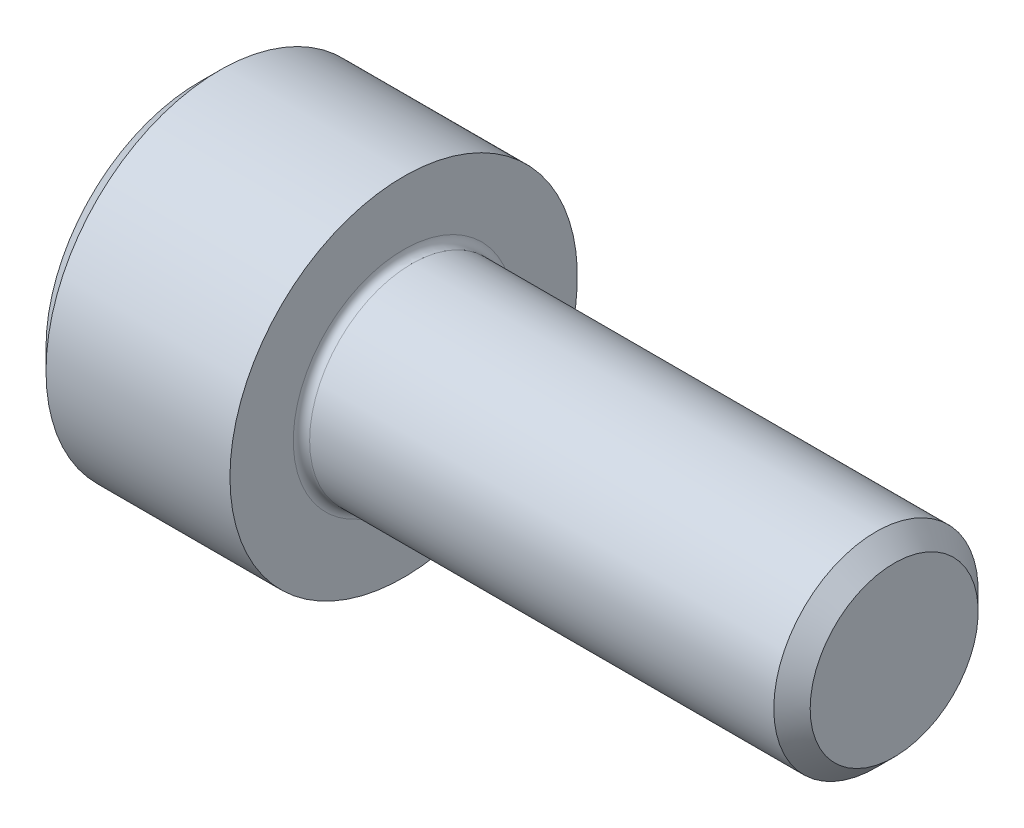
ISO-10303-21;
HEADER;
FILE_DESCRIPTION(('STEP AP214'),'2;1');
FILE_NAME('part.step','',(''),(''),'','','');
FILE_SCHEMA(('AUTOMOTIVE_DESIGN { 1 0 10303 214 1 1 1 1 }'));
ENDSEC;
DATA;
#1=APPLICATION_CONTEXT('core data for automotive mechanical design processes');
#2=APPLICATION_PROTOCOL_DEFINITION('international standard','automotive_design',2000,#1);
#3=PRODUCT_CONTEXT('',#1,'mechanical');
#4=PRODUCT('Part','Part','',(#3));
#5=PRODUCT_RELATED_PRODUCT_CATEGORY('part','',(#4));
#6=PRODUCT_DEFINITION_FORMATION('','',#4);
#7=PRODUCT_DEFINITION_CONTEXT('part definition',#1,'design');
#8=PRODUCT_DEFINITION('design','',#6,#7);
#9=PRODUCT_DEFINITION_SHAPE('','',#8);
#10=(LENGTH_UNIT() NAMED_UNIT(*) SI_UNIT(.MILLI.,.METRE.));
#11=(NAMED_UNIT(*) PLANE_ANGLE_UNIT() SI_UNIT($,.RADIAN.));
#12=(NAMED_UNIT(*) SI_UNIT($,.STERADIAN.) SOLID_ANGLE_UNIT());
#13=UNCERTAINTY_MEASURE_WITH_UNIT(LENGTH_MEASURE(1.E-05),#10,'distance_accuracy_value','');
#14=(GEOMETRIC_REPRESENTATION_CONTEXT(3) GLOBAL_UNCERTAINTY_ASSIGNED_CONTEXT((#13)) GLOBAL_UNIT_ASSIGNED_CONTEXT((#10,
#11,#12)) REPRESENTATION_CONTEXT('',''));
#15=CARTESIAN_POINT('',(0.,0.,0.));
#16=DIRECTION('',(0.,0.,1.));
#17=DIRECTION('',(1.,0.,0.));
#18=AXIS2_PLACEMENT_3D('',#15,#16,#17);
#19=CARTESIAN_POINT('',(0.,0.,0.));
#20=DIRECTION('',(-1.,0.,0.));
#21=DIRECTION('',(0.,0.,1.));
#22=AXIS2_PLACEMENT_3D('',#19,#20,#21);
#23=PLANE('',#22);
#24=DIRECTION('',(0.,-0.499999999999999,0.866025403784439));
#25=VECTOR('',#24,1.);
#26=CARTESIAN_POINT('',(0.,2.35789849937043,0.));
#27=LINE('',#26,#25);
#28=CARTESIAN_POINT('',(0.,2.35789849937043,0.));
#29=VERTEX_POINT('',#28);
#30=CARTESIAN_POINT('',(0.,1.17894924968522,2.042));
#31=VERTEX_POINT('',#30);
#32=EDGE_CURVE('E262',#29,#31,#27,.T.);
#33=ORIENTED_EDGE('',*,*,#32,.T.);
#34=DIRECTION('',(0.,1.,0.));
#35=VECTOR('',#34,1.);
#36=CARTESIAN_POINT('',(0.,-1.17894924968522,2.042));
#37=LINE('',#36,#35);
#38=CARTESIAN_POINT('',(0.,-1.17894924968522,2.042));
#39=VERTEX_POINT('',#38);
#40=EDGE_CURVE('E133',#39,#31,#37,.T.);
#41=ORIENTED_EDGE('',*,*,#40,.F.);
#42=DIRECTION('',(0.,-0.500000000000001,-0.866025403784438));
#43=VECTOR('',#42,1.);
#44=CARTESIAN_POINT('',(0.,-1.17894924968522,2.042));
#45=LINE('',#44,#43);
#46=CARTESIAN_POINT('',(0.,-2.35789849937043,0.));
#47=VERTEX_POINT('',#46);
#48=EDGE_CURVE('E265',#39,#47,#45,.T.);
#49=ORIENTED_EDGE('',*,*,#48,.T.);
#50=DIRECTION('',(0.,0.499999999999998,-0.86602540378444));
#51=VECTOR('',#50,1.);
#52=CARTESIAN_POINT('',(0.,-2.35789849937043,0.));
#53=LINE('',#52,#51);
#54=CARTESIAN_POINT('',(0.,-1.17894924968522,-2.042));
#55=VERTEX_POINT('',#54);
#56=EDGE_CURVE('E268',#47,#55,#53,.T.);
#57=ORIENTED_EDGE('',*,*,#56,.T.);
#58=DIRECTION('',(0.,-1.,0.));
#59=VECTOR('',#58,1.);
#60=CARTESIAN_POINT('',(0.,1.17894924968521,-2.042));
#61=LINE('',#60,#59);
#62=CARTESIAN_POINT('',(0.,1.17894924968521,-2.042));
#63=VERTEX_POINT('',#62);
#64=EDGE_CURVE('E271',#63,#55,#61,.T.);
#65=ORIENTED_EDGE('',*,*,#64,.F.);
#66=DIRECTION('',(0.,-0.500000000000001,-0.866025403784438));
#67=VECTOR('',#66,1.);
#68=CARTESIAN_POINT('',(0.,2.35789849937043,0.));
#69=LINE('',#68,#67);
#70=EDGE_CURVE('E128',#29,#63,#69,.T.);
#71=ORIENTED_EDGE('',*,*,#70,.F.);
#72=EDGE_LOOP('',(#33,#41,#49,#57,#65,#71));
#73=FACE_BOUND('',#72,.T.);
#74=CARTESIAN_POINT('',(0.,0.,0.));
#75=DIRECTION('',(-1.,0.,0.));
#76=DIRECTION('',(0.,0.,1.));
#77=AXIS2_PLACEMENT_3D('',#74,#75,#76);
#78=CIRCLE('',#77,3.75);
#79=CARTESIAN_POINT('',(0.,0.,3.75));
#80=VERTEX_POINT('',#79);
#81=EDGE_CURVE('E157',#80,#80,#78,.T.);
#82=ORIENTED_EDGE('',*,*,#81,.T.);
#83=EDGE_LOOP('',(#82));
#84=FACE_BOUND('',#83,.T.);
#85=ADVANCED_FACE('F37',(#73,#84),#23,.T.);
#86=CARTESIAN_POINT('',(0.,0.,0.));
#87=DIRECTION('',(1.,0.,0.));
#88=DIRECTION('',(0.,0.,-1.));
#89=AXIS2_PLACEMENT_3D('',#86,#87,#88);
#90=CONICAL_SURFACE('',#89,3.75,0.785398163397443);
#91=CARTESIAN_POINT('',(0.5,0.,0.));
#92=DIRECTION('',(-1.,0.,0.));
#93=DIRECTION('',(0.,0.,1.));
#94=AXIS2_PLACEMENT_3D('',#91,#92,#93);
#95=CIRCLE('',#94,4.25);
#96=CARTESIAN_POINT('',(0.5,0.,4.25));
#97=VERTEX_POINT('',#96);
#98=EDGE_CURVE('E154',#97,#97,#95,.T.);
#99=ORIENTED_EDGE('',*,*,#98,.T.);
#100=EDGE_LOOP('',(#99));
#101=FACE_BOUND('',#100,.T.);
#102=ORIENTED_EDGE('',*,*,#81,.F.);
#103=EDGE_LOOP('',(#102));
#104=FACE_BOUND('',#103,.T.);
#105=ADVANCED_FACE('F178',(#101,#104),#90,.T.);
#106=CARTESIAN_POINT('',(-31.75,0.,0.));
#107=DIRECTION('',(-1.,0.,0.));
#108=DIRECTION('',(0.,0.,1.));
#109=AXIS2_PLACEMENT_3D('',#106,#107,#108);
#110=CYLINDRICAL_SURFACE('',#109,4.25);
#111=CARTESIAN_POINT('',(5.,0.,0.));
#112=DIRECTION('',(-1.,0.,0.));
#113=DIRECTION('',(0.,0.,1.));
#114=AXIS2_PLACEMENT_3D('',#111,#112,#113);
#115=CIRCLE('',#114,4.25);
#116=CARTESIAN_POINT('',(5.,0.,4.25));
#117=VERTEX_POINT('',#116);
#118=EDGE_CURVE('E151',#117,#117,#115,.T.);
#119=ORIENTED_EDGE('',*,*,#118,.T.);
#120=EDGE_LOOP('',(#119));
#121=FACE_BOUND('',#120,.T.);
#122=ORIENTED_EDGE('',*,*,#98,.F.);
#123=EDGE_LOOP('',(#122));
#124=FACE_BOUND('',#123,.T.);
#125=ADVANCED_FACE('F183',(#121,#124),#110,.T.);
#126=CARTESIAN_POINT('',(5.,4.25,0.));
#127=DIRECTION('',(1.,0.,0.));
#128=DIRECTION('',(0.,0.,-1.));
#129=AXIS2_PLACEMENT_3D('',#126,#127,#128);
#130=PLANE('',#129);
#131=CARTESIAN_POINT('',(5.,0.,0.));
#132=DIRECTION('',(1.,0.,0.));
#133=DIRECTION('',(0.,0.,-1.));
#134=AXIS2_PLACEMENT_3D('',#131,#132,#133);
#135=CIRCLE('',#134,2.7);
#136=CARTESIAN_POINT('',(5.,0.,-2.7));
#137=VERTEX_POINT('',#136);
#138=EDGE_CURVE('E45',#137,#137,#135,.F.);
#139=ORIENTED_EDGE('',*,*,#138,.T.);
#140=EDGE_LOOP('',(#139));
#141=FACE_BOUND('',#140,.T.);
#142=ORIENTED_EDGE('',*,*,#118,.F.);
#143=EDGE_LOOP('',(#142));
#144=FACE_BOUND('',#143,.T.);
#145=ADVANCED_FACE('F162',(#141,#144),#130,.T.);
#146=CARTESIAN_POINT('',(-31.75,0.,0.));
#147=DIRECTION('',(-1.,0.,0.));
#148=DIRECTION('',(0.,0.,1.));
#149=AXIS2_PLACEMENT_3D('',#146,#147,#148);
#150=CYLINDRICAL_SURFACE('',#149,2.5);
#151=CARTESIAN_POINT('',(5.2,0.,0.));
#152=DIRECTION('',(1.,0.,0.));
#153=DIRECTION('',(0.,0.,-1.));
#154=AXIS2_PLACEMENT_3D('',#151,#152,#153);
#155=CIRCLE('',#154,2.5);
#156=CARTESIAN_POINT('',(5.2,0.,-2.5));
#157=VERTEX_POINT('',#156);
#158=EDGE_CURVE('E11',#157,#157,#155,.T.);
#159=ORIENTED_EDGE('',*,*,#158,.T.);
#160=EDGE_LOOP('',(#159));
#161=FACE_BOUND('',#160,.T.);
#162=CARTESIAN_POINT('',(16.555,0.,0.));
#163=DIRECTION('',(-1.,0.,0.));
#164=DIRECTION('',(0.,0.,1.));
#165=AXIS2_PLACEMENT_3D('',#162,#163,#164);
#166=CIRCLE('',#165,2.5);
#167=CARTESIAN_POINT('',(16.555,0.,2.5));
#168=VERTEX_POINT('',#167);
#169=EDGE_CURVE('E148',#168,#168,#166,.T.);
#170=ORIENTED_EDGE('',*,*,#169,.T.);
#171=EDGE_LOOP('',(#170));
#172=FACE_BOUND('',#171,.T.);
#173=ADVANCED_FACE('F193',(#161,#172),#150,.T.);
#174=CARTESIAN_POINT('',(17.,0.,0.));
#175=DIRECTION('',(-1.,0.,0.));
#176=DIRECTION('',(0.,0.,1.));
#177=AXIS2_PLACEMENT_3D('',#174,#175,#176);
#178=CONICAL_SURFACE('',#177,2.055,0.785398163397462);
#179=ORIENTED_EDGE('',*,*,#169,.F.);
#180=EDGE_LOOP('',(#179));
#181=FACE_BOUND('',#180,.T.);
#182=CARTESIAN_POINT('',(17.,0.,0.));
#183=DIRECTION('',(-1.,0.,0.));
#184=DIRECTION('',(0.,0.,1.));
#185=AXIS2_PLACEMENT_3D('',#182,#183,#184);
#186=CIRCLE('',#185,2.055);
#187=CARTESIAN_POINT('',(17.,0.,2.055));
#188=VERTEX_POINT('',#187);
#189=EDGE_CURVE('E144',#188,#188,#186,.T.);
#190=ORIENTED_EDGE('',*,*,#189,.T.);
#191=EDGE_LOOP('',(#190));
#192=FACE_BOUND('',#191,.T.);
#193=ADVANCED_FACE('F173',(#181,#192),#178,.T.);
#194=CARTESIAN_POINT('',(17.,2.055,0.));
#195=DIRECTION('',(1.,0.,0.));
#196=DIRECTION('',(0.,0.,-1.));
#197=AXIS2_PLACEMENT_3D('',#194,#195,#196);
#198=PLANE('',#197);
#199=ORIENTED_EDGE('',*,*,#189,.F.);
#200=EDGE_LOOP('',(#199));
#201=FACE_BOUND('',#200,.T.);
#202=ADVANCED_FACE('F166',(#201),#198,.T.);
#203=CARTESIAN_POINT('',(5.2,0.,0.));
#204=DIRECTION('',(1.,0.,0.));
#205=DIRECTION('',(0.,0.,-1.));
#206=AXIS2_PLACEMENT_3D('',#203,#204,#205);
#207=TOROIDAL_SURFACE('',#206,2.7,0.2);
#208=ORIENTED_EDGE('',*,*,#158,.F.);
#209=EDGE_LOOP('',(#208));
#210=FACE_BOUND('',#209,.T.);
#211=ORIENTED_EDGE('',*,*,#138,.F.);
#212=EDGE_LOOP('',(#211));
#213=FACE_BOUND('',#212,.T.);
#214=ADVANCED_FACE('F39',(#210,#213),#207,.F.);
#215=CARTESIAN_POINT('',(2.5,2.35789849937043,0.));
#216=DIRECTION('',(0.,-0.866025403784439,-0.499999999999999));
#217=DIRECTION('',(0.,0.499999999999999,-0.866025403784439));
#218=AXIS2_PLACEMENT_3D('',#215,#216,#217);
#219=PLANE('',#218);
#220=ORIENTED_EDGE('',*,*,#32,.F.);
#221=DIRECTION('',(-1.,0.,0.));
#222=VECTOR('',#221,1.);
#223=CARTESIAN_POINT('',(2.5,2.35789849937043,0.));
#224=LINE('',#223,#222);
#225=CARTESIAN_POINT('',(2.5,2.35789849937043,0.));
#226=VERTEX_POINT('',#225);
#227=EDGE_CURVE('E252',#226,#29,#224,.T.);
#228=ORIENTED_EDGE('',*,*,#227,.F.);
#229=DIRECTION('',(0.,-0.499999999999999,0.866025403784439));
#230=VECTOR('',#229,1.);
#231=CARTESIAN_POINT('',(2.5,2.35789849937043,0.));
#232=LINE('',#231,#230);
#233=CARTESIAN_POINT('',(2.5,1.76842387452782,1.021));
#234=VERTEX_POINT('',#233);
#235=EDGE_CURVE('E120',#226,#234,#232,.T.);
#236=ORIENTED_EDGE('',*,*,#235,.T.);
#237=CARTESIAN_POINT('',(2.5,1.17894924968522,2.042));
#238=VERTEX_POINT('',#237);
#239=EDGE_CURVE('E111',#234,#238,#232,.T.);
#240=ORIENTED_EDGE('',*,*,#239,.T.);
#241=DIRECTION('',(-1.,0.,0.));
#242=VECTOR('',#241,1.);
#243=CARTESIAN_POINT('',(2.5,1.17894924968522,2.042));
#244=LINE('',#243,#242);
#245=EDGE_CURVE('E125',#238,#31,#244,.T.);
#246=ORIENTED_EDGE('',*,*,#245,.T.);
#247=EDGE_LOOP('',(#220,#228,#236,#240,#246));
#248=FACE_BOUND('',#247,.T.);
#249=ADVANCED_FACE('F124',(#248),#219,.T.);
#250=CARTESIAN_POINT('',(2.5,-1.17894924968522,2.042));
#251=DIRECTION('',(0.,0.,1.));
#252=DIRECTION('',(0.,-1.,0.));
#253=AXIS2_PLACEMENT_3D('',#250,#251,#252);
#254=PLANE('',#253);
#255=ORIENTED_EDGE('',*,*,#40,.T.);
#256=ORIENTED_EDGE('',*,*,#245,.F.);
#257=DIRECTION('',(0.,1.,0.));
#258=VECTOR('',#257,1.);
#259=CARTESIAN_POINT('',(2.5,-1.17894924968522,2.042));
#260=LINE('',#259,#258);
#261=CARTESIAN_POINT('',(2.5,0.,2.042));
#262=VERTEX_POINT('',#261);
#263=EDGE_CURVE('E108',#262,#238,#260,.T.);
#264=ORIENTED_EDGE('',*,*,#263,.F.);
#265=CARTESIAN_POINT('',(2.5,-1.17894924968522,2.042));
#266=VERTEX_POINT('',#265);
#267=EDGE_CURVE('E119',#266,#262,#260,.T.);
#268=ORIENTED_EDGE('',*,*,#267,.F.);
#269=DIRECTION('',(-1.,0.,0.));
#270=VECTOR('',#269,1.);
#271=CARTESIAN_POINT('',(2.5,-1.17894924968522,2.042));
#272=LINE('',#271,#270);
#273=EDGE_CURVE('E135',#266,#39,#272,.T.);
#274=ORIENTED_EDGE('',*,*,#273,.T.);
#275=EDGE_LOOP('',(#255,#256,#264,#268,#274));
#276=FACE_BOUND('',#275,.T.);
#277=ADVANCED_FACE('F130',(#276),#254,.F.);
#278=CARTESIAN_POINT('',(2.5,-1.17894924968522,2.042));
#279=DIRECTION('',(0.,0.866025403784438,-0.500000000000001));
#280=DIRECTION('',(0.,0.500000000000001,0.866025403784438));
#281=AXIS2_PLACEMENT_3D('',#278,#279,#280);
#282=PLANE('',#281);
#283=ORIENTED_EDGE('',*,*,#48,.F.);
#284=ORIENTED_EDGE('',*,*,#273,.F.);
#285=DIRECTION('',(0.,-0.500000000000001,-0.866025403784438));
#286=VECTOR('',#285,1.);
#287=CARTESIAN_POINT('',(2.5,-1.17894924968522,2.042));
#288=LINE('',#287,#286);
#289=CARTESIAN_POINT('',(2.5,-1.76842387452782,1.021));
#290=VERTEX_POINT('',#289);
#291=EDGE_CURVE('E291',#266,#290,#288,.T.);
#292=ORIENTED_EDGE('',*,*,#291,.T.);
#293=CARTESIAN_POINT('',(2.5,-2.35789849937043,0.));
#294=VERTEX_POINT('',#293);
#295=EDGE_CURVE('E280',#290,#294,#288,.T.);
#296=ORIENTED_EDGE('',*,*,#295,.T.);
#297=DIRECTION('',(-1.,0.,0.));
#298=VECTOR('',#297,1.);
#299=CARTESIAN_POINT('',(2.5,-2.35789849937043,0.));
#300=LINE('',#299,#298);
#301=EDGE_CURVE('E140',#294,#47,#300,.T.);
#302=ORIENTED_EDGE('',*,*,#301,.T.);
#303=EDGE_LOOP('',(#283,#284,#292,#296,#302));
#304=FACE_BOUND('',#303,.T.);
#305=ADVANCED_FACE('F206',(#304),#282,.T.);
#306=CARTESIAN_POINT('',(2.5,-2.35789849937043,0.));
#307=DIRECTION('',(0.,0.86602540378444,0.499999999999998));
#308=DIRECTION('',(0.,-0.499999999999998,0.86602540378444));
#309=AXIS2_PLACEMENT_3D('',#306,#307,#308);
#310=PLANE('',#309);
#311=ORIENTED_EDGE('',*,*,#56,.F.);
#312=ORIENTED_EDGE('',*,*,#301,.F.);
#313=DIRECTION('',(0.,0.499999999999998,-0.86602540378444));
#314=VECTOR('',#313,1.);
#315=CARTESIAN_POINT('',(2.5,-2.35789849937043,0.));
#316=LINE('',#315,#314);
#317=CARTESIAN_POINT('',(2.5,-1.76842387452783,-1.021));
#318=VERTEX_POINT('',#317);
#319=EDGE_CURVE('E258',#294,#318,#316,.T.);
#320=ORIENTED_EDGE('',*,*,#319,.T.);
#321=CARTESIAN_POINT('',(2.5,-1.17894924968522,-2.042));
#322=VERTEX_POINT('',#321);
#323=EDGE_CURVE('E290',#318,#322,#316,.T.);
#324=ORIENTED_EDGE('',*,*,#323,.T.);
#325=DIRECTION('',(-1.,0.,0.));
#326=VECTOR('',#325,1.);
#327=CARTESIAN_POINT('',(2.5,-1.17894924968522,-2.042));
#328=LINE('',#327,#326);
#329=EDGE_CURVE('E251',#322,#55,#328,.T.);
#330=ORIENTED_EDGE('',*,*,#329,.T.);
#331=EDGE_LOOP('',(#311,#312,#320,#324,#330));
#332=FACE_BOUND('',#331,.T.);
#333=ADVANCED_FACE('F209',(#332),#310,.T.);
#334=CARTESIAN_POINT('',(2.5,1.17894924968521,-2.042));
#335=DIRECTION('',(0.,0.,-1.));
#336=DIRECTION('',(0.,1.,0.));
#337=AXIS2_PLACEMENT_3D('',#334,#335,#336);
#338=PLANE('',#337);
#339=ORIENTED_EDGE('',*,*,#64,.T.);
#340=ORIENTED_EDGE('',*,*,#329,.F.);
#341=DIRECTION('',(0.,-1.,0.));
#342=VECTOR('',#341,1.);
#343=CARTESIAN_POINT('',(2.5,1.17894924968521,-2.042));
#344=LINE('',#343,#342);
#345=CARTESIAN_POINT('',(2.5,0.,-2.042));
#346=VERTEX_POINT('',#345);
#347=EDGE_CURVE('E255',#346,#322,#344,.T.);
#348=ORIENTED_EDGE('',*,*,#347,.F.);
#349=CARTESIAN_POINT('',(2.5,1.17894924968521,-2.042));
#350=VERTEX_POINT('',#349);
#351=EDGE_CURVE('E52',#350,#346,#344,.T.);
#352=ORIENTED_EDGE('',*,*,#351,.F.);
#353=DIRECTION('',(-1.,0.,0.));
#354=VECTOR('',#353,1.);
#355=CARTESIAN_POINT('',(2.5,1.17894924968521,-2.042));
#356=LINE('',#355,#354);
#357=EDGE_CURVE('E248',#350,#63,#356,.T.);
#358=ORIENTED_EDGE('',*,*,#357,.T.);
#359=EDGE_LOOP('',(#339,#340,#348,#352,#358));
#360=FACE_BOUND('',#359,.T.);
#361=ADVANCED_FACE('F213',(#360),#338,.F.);
#362=CARTESIAN_POINT('',(2.5,2.35789849937043,0.));
#363=DIRECTION('',(0.,0.866025403784438,-0.500000000000001));
#364=DIRECTION('',(0.,0.500000000000001,0.866025403784438));
#365=AXIS2_PLACEMENT_3D('',#362,#363,#364);
#366=PLANE('',#365);
#367=ORIENTED_EDGE('',*,*,#70,.T.);
#368=ORIENTED_EDGE('',*,*,#357,.F.);
#369=DIRECTION('',(0.,-0.500000000000001,-0.866025403784438));
#370=VECTOR('',#369,1.);
#371=CARTESIAN_POINT('',(2.5,2.35789849937043,0.));
#372=LINE('',#371,#370);
#373=CARTESIAN_POINT('',(2.5,1.76842387452782,-1.021));
#374=VERTEX_POINT('',#373);
#375=EDGE_CURVE('E238',#374,#350,#372,.T.);
#376=ORIENTED_EDGE('',*,*,#375,.F.);
#377=EDGE_CURVE('E244',#226,#374,#372,.T.);
#378=ORIENTED_EDGE('',*,*,#377,.F.);
#379=ORIENTED_EDGE('',*,*,#227,.T.);
#380=EDGE_LOOP('',(#367,#368,#376,#378,#379));
#381=FACE_BOUND('',#380,.T.);
#382=ADVANCED_FACE('F217',(#381),#366,.F.);
#383=CARTESIAN_POINT('',(2.5,3.53684774905564,-2.04200000000001));
#384=DIRECTION('',(1.,0.,0.));
#385=DIRECTION('',(0.,0.,-1.));
#386=AXIS2_PLACEMENT_3D('',#383,#384,#385);
#387=PLANE('',#386);
#388=ORIENTED_EDGE('',*,*,#347,.T.);
#389=ORIENTED_EDGE('',*,*,#323,.F.);
#390=CARTESIAN_POINT('',(2.5,0.,0.));
#391=DIRECTION('',(-1.,0.,0.));
#392=DIRECTION('',(0.,0.,1.));
#393=AXIS2_PLACEMENT_3D('',#390,#391,#392);
#394=CIRCLE('',#393,2.042);
#395=EDGE_CURVE('E286',#346,#318,#394,.T.);
#396=ORIENTED_EDGE('',*,*,#395,.F.);
#397=EDGE_LOOP('',(#388,#389,#396));
#398=FACE_BOUND('',#397,.T.);
#399=ADVANCED_FACE('F221',(#398),#387,.F.);
#400=ORIENTED_EDGE('',*,*,#319,.F.);
#401=ORIENTED_EDGE('',*,*,#295,.F.);
#402=EDGE_CURVE('E138',#318,#290,#394,.T.);
#403=ORIENTED_EDGE('',*,*,#402,.F.);
#404=EDGE_LOOP('',(#400,#401,#403));
#405=FACE_BOUND('',#404,.T.);
#406=ADVANCED_FACE('F224',(#405),#387,.F.);
#407=ORIENTED_EDGE('',*,*,#291,.F.);
#408=ORIENTED_EDGE('',*,*,#267,.T.);
#409=EDGE_CURVE('E134',#290,#262,#394,.T.);
#410=ORIENTED_EDGE('',*,*,#409,.F.);
#411=EDGE_LOOP('',(#407,#408,#410));
#412=FACE_BOUND('',#411,.T.);
#413=ADVANCED_FACE('F229',(#412),#387,.F.);
#414=ORIENTED_EDGE('',*,*,#263,.T.);
#415=ORIENTED_EDGE('',*,*,#239,.F.);
#416=EDGE_CURVE('E114',#262,#234,#394,.T.);
#417=ORIENTED_EDGE('',*,*,#416,.F.);
#418=EDGE_LOOP('',(#414,#415,#417));
#419=FACE_BOUND('',#418,.T.);
#420=ADVANCED_FACE('F110',(#419),#387,.F.);
#421=ORIENTED_EDGE('',*,*,#235,.F.);
#422=ORIENTED_EDGE('',*,*,#377,.T.);
#423=EDGE_CURVE('E145',#234,#374,#394,.T.);
#424=ORIENTED_EDGE('',*,*,#423,.F.);
#425=EDGE_LOOP('',(#421,#422,#424));
#426=FACE_BOUND('',#425,.T.);
#427=ADVANCED_FACE('F232',(#426),#387,.F.);
#428=ORIENTED_EDGE('',*,*,#375,.T.);
#429=ORIENTED_EDGE('',*,*,#351,.T.);
#430=EDGE_CURVE('E241',#374,#346,#394,.T.);
#431=ORIENTED_EDGE('',*,*,#430,.F.);
#432=EDGE_LOOP('',(#428,#429,#431));
#433=FACE_BOUND('',#432,.T.);
#434=ADVANCED_FACE('F202',(#433),#387,.F.);
#435=CARTESIAN_POINT('',(2.5,0.,0.));
#436=DIRECTION('',(-1.,0.,0.));
#437=DIRECTION('',(0.,0.,1.));
#438=AXIS2_PLACEMENT_3D('',#435,#436,#437);
#439=CONICAL_SURFACE('',#438,2.042,1.04719755119659);
#440=CARTESIAN_POINT('',(3.67894924968523,0.,0.));
#441=VERTEX_POINT('',#440);
#442=VERTEX_LOOP('',#441);
#443=FACE_BOUND('',#442,.T.);
#444=ORIENTED_EDGE('',*,*,#416,.T.);
#445=ORIENTED_EDGE('',*,*,#423,.T.);
#446=ORIENTED_EDGE('',*,*,#430,.T.);
#447=ORIENTED_EDGE('',*,*,#395,.T.);
#448=ORIENTED_EDGE('',*,*,#402,.T.);
#449=ORIENTED_EDGE('',*,*,#409,.T.);
#450=EDGE_LOOP('',(#444,#445,#446,#447,#448,#449));
#451=FACE_BOUND('',#450,.T.);
#452=ADVANCED_FACE('F200',(#443,#451),#439,.F.);
#453=CLOSED_SHELL('',(#85,#105,#125,#145,#173,#193,#202,#214,#249,#277,#305,#333,#361,#382,#399,
#406,#413,#420,#427,#434,#452));
#454=MANIFOLD_SOLID_BREP('B2',#453);
#455=ADVANCED_BREP_SHAPE_REPRESENTATION('',(#18,#454),#14);
#456=SHAPE_DEFINITION_REPRESENTATION(#9,#455);
ENDSEC;
END-ISO-10303-21;
